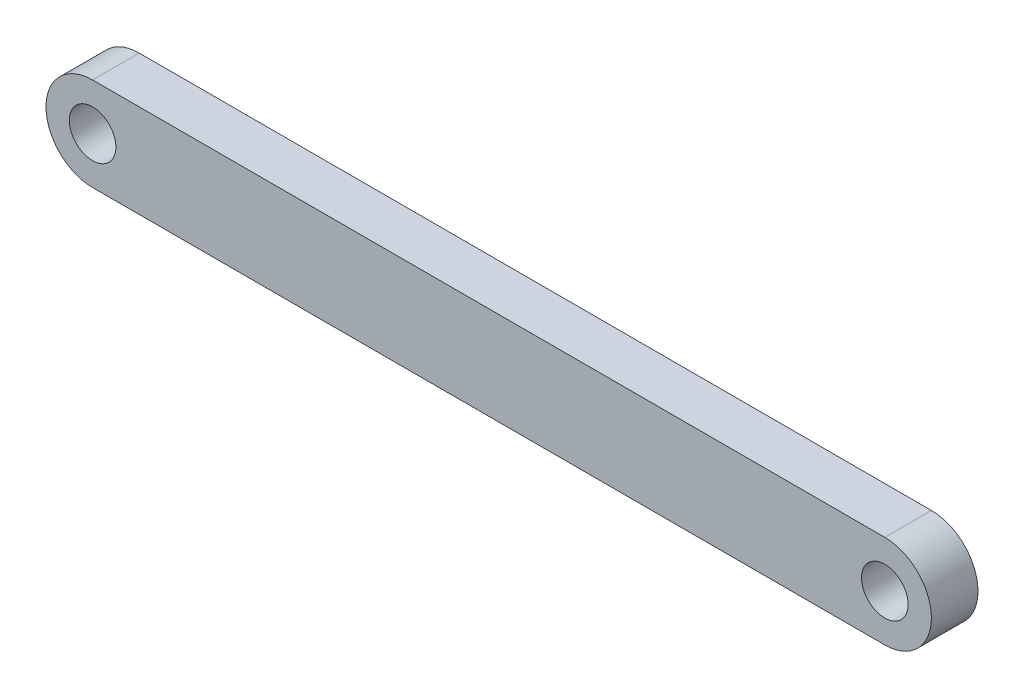
ISO-10303-21;
HEADER;
FILE_DESCRIPTION(('STEP AP214'),'2;1');
FILE_NAME('part.step','',(''),(''),'','','');
FILE_SCHEMA(('AUTOMOTIVE_DESIGN { 1 0 10303 214 1 1 1 1 }'));
ENDSEC;
DATA;
#1=APPLICATION_CONTEXT('core data for automotive mechanical design processes');
#2=APPLICATION_PROTOCOL_DEFINITION('international standard','automotive_design',2000,#1);
#3=PRODUCT_CONTEXT('',#1,'mechanical');
#4=PRODUCT('Part','Part','',(#3));
#5=PRODUCT_RELATED_PRODUCT_CATEGORY('part','',(#4));
#6=PRODUCT_DEFINITION_FORMATION('','',#4);
#7=PRODUCT_DEFINITION_CONTEXT('part definition',#1,'design');
#8=PRODUCT_DEFINITION('design','',#6,#7);
#9=PRODUCT_DEFINITION_SHAPE('','',#8);
#10=(LENGTH_UNIT() NAMED_UNIT(*) SI_UNIT(.MILLI.,.METRE.));
#11=(NAMED_UNIT(*) PLANE_ANGLE_UNIT() SI_UNIT($,.RADIAN.));
#12=(NAMED_UNIT(*) SI_UNIT($,.STERADIAN.) SOLID_ANGLE_UNIT());
#13=UNCERTAINTY_MEASURE_WITH_UNIT(LENGTH_MEASURE(1.E-05),#10,'distance_accuracy_value','');
#14=(GEOMETRIC_REPRESENTATION_CONTEXT(3) GLOBAL_UNCERTAINTY_ASSIGNED_CONTEXT((#13)) GLOBAL_UNIT_ASSIGNED_CONTEXT((#10,
#11,#12)) REPRESENTATION_CONTEXT('',''));
#15=CARTESIAN_POINT('',(0.,0.,0.));
#16=DIRECTION('',(0.,0.,1.));
#17=DIRECTION('',(1.,0.,0.));
#18=AXIS2_PLACEMENT_3D('',#15,#16,#17);
#19=CARTESIAN_POINT('',(-16.9999999773704,0.000877157800007862,2.));
#20=DIRECTION('',(0.,0.,1.));
#21=DIRECTION('',(1.,0.,0.));
#22=AXIS2_PLACEMENT_3D('',#19,#20,#21);
#23=PLANE('',#22);
#24=CARTESIAN_POINT('',(-16.9999999773704,0.000877157800007862,2.));
#25=DIRECTION('',(0.,0.,1.));
#26=DIRECTION('',(1.,0.,0.));
#27=AXIS2_PLACEMENT_3D('',#24,#25,#26);
#28=CIRCLE('',#27,1.);
#29=CARTESIAN_POINT('',(-15.9999999773704,0.000877157800007862,2.));
#30=VERTEX_POINT('',#29);
#31=EDGE_CURVE('E100',#30,#30,#28,.T.);
#32=ORIENTED_EDGE('',*,*,#31,.F.);
#33=EDGE_LOOP('',(#32));
#34=FACE_BOUND('',#33,.T.);
#35=CARTESIAN_POINT('',(-16.9999999773704,0.000877157800007862,2.));
#36=DIRECTION('',(0.,0.,1.));
#37=DIRECTION('',(1.,0.,0.));
#38=AXIS2_PLACEMENT_3D('',#35,#36,#37);
#39=CIRCLE('',#38,2.);
#40=CARTESIAN_POINT('',(-16.9999999773704,2.00087715780001,2.));
#41=VERTEX_POINT('',#40);
#42=CARTESIAN_POINT('',(-16.9999999773704,-1.99912284219999,2.));
#43=VERTEX_POINT('',#42);
#44=EDGE_CURVE('E85',#41,#43,#39,.T.);
#45=ORIENTED_EDGE('',*,*,#44,.T.);
#46=DIRECTION('',(1.,0.,0.));
#47=VECTOR('',#46,1.);
#48=CARTESIAN_POINT('',(-16.9999999773704,-1.99912284219999,2.));
#49=LINE('',#48,#47);
#50=CARTESIAN_POINT('',(17.0000000226296,-1.99912284219999,2.));
#51=VERTEX_POINT('',#50);
#52=EDGE_CURVE('E80',#43,#51,#49,.T.);
#53=ORIENTED_EDGE('',*,*,#52,.T.);
#54=CARTESIAN_POINT('',(17.0000000226296,0.000877157800007862,2.));
#55=DIRECTION('',(0.,0.,1.));
#56=DIRECTION('',(1.,0.,0.));
#57=AXIS2_PLACEMENT_3D('',#54,#55,#56);
#58=CIRCLE('',#57,2.);
#59=CARTESIAN_POINT('',(17.0000000226296,2.00087715780001,2.));
#60=VERTEX_POINT('',#59);
#61=EDGE_CURVE('E83',#51,#60,#58,.T.);
#62=ORIENTED_EDGE('',*,*,#61,.T.);
#63=DIRECTION('',(-1.,0.,0.));
#64=VECTOR('',#63,1.);
#65=CARTESIAN_POINT('',(-16.9999999773704,2.00087715780001,2.));
#66=LINE('',#65,#64);
#67=EDGE_CURVE('E50',#60,#41,#66,.T.);
#68=ORIENTED_EDGE('',*,*,#67,.T.);
#69=EDGE_LOOP('',(#45,#53,#62,#68));
#70=FACE_BOUND('',#69,.T.);
#71=CARTESIAN_POINT('',(17.0000000226296,0.000877157800007862,2.));
#72=DIRECTION('',(0.,0.,1.));
#73=DIRECTION('',(1.,0.,0.));
#74=AXIS2_PLACEMENT_3D('',#71,#72,#73);
#75=CIRCLE('',#74,1.);
#76=CARTESIAN_POINT('',(18.0000000226296,0.000877157800007862,2.));
#77=VERTEX_POINT('',#76);
#78=EDGE_CURVE('E115',#77,#77,#75,.T.);
#79=ORIENTED_EDGE('',*,*,#78,.F.);
#80=EDGE_LOOP('',(#79));
#81=FACE_BOUND('',#80,.T.);
#82=ADVANCED_FACE('F33',(#34,#70,#81),#23,.T.);
#83=CARTESIAN_POINT('',(-16.9999999773704,0.000877157800007862,0.));
#84=DIRECTION('',(0.,0.,1.));
#85=DIRECTION('',(1.,0.,0.));
#86=AXIS2_PLACEMENT_3D('',#83,#84,#85);
#87=PLANE('',#86);
#88=CARTESIAN_POINT('',(-16.9999999773704,0.000877157800007862,0.));
#89=DIRECTION('',(0.,0.,1.));
#90=DIRECTION('',(1.,0.,0.));
#91=AXIS2_PLACEMENT_3D('',#88,#89,#90);
#92=CIRCLE('',#91,2.);
#93=CARTESIAN_POINT('',(-16.9999999773704,2.00087715780001,0.));
#94=VERTEX_POINT('',#93);
#95=CARTESIAN_POINT('',(-16.9999999773704,-1.99912284219999,0.));
#96=VERTEX_POINT('',#95);
#97=EDGE_CURVE('E97',#94,#96,#92,.T.);
#98=ORIENTED_EDGE('',*,*,#97,.F.);
#99=DIRECTION('',(-1.,0.,0.));
#100=VECTOR('',#99,1.);
#101=CARTESIAN_POINT('',(-16.9999999773704,2.00087715780001,0.));
#102=LINE('',#101,#100);
#103=CARTESIAN_POINT('',(17.0000000226296,2.00087715780001,0.));
#104=VERTEX_POINT('',#103);
#105=EDGE_CURVE('E73',#104,#94,#102,.T.);
#106=ORIENTED_EDGE('',*,*,#105,.F.);
#107=CARTESIAN_POINT('',(17.0000000226296,0.000877157800007862,0.));
#108=DIRECTION('',(0.,0.,1.));
#109=DIRECTION('',(1.,0.,0.));
#110=AXIS2_PLACEMENT_3D('',#107,#108,#109);
#111=CIRCLE('',#110,2.);
#112=CARTESIAN_POINT('',(17.0000000226296,-1.99912284219999,0.));
#113=VERTEX_POINT('',#112);
#114=EDGE_CURVE('E67',#113,#104,#111,.T.);
#115=ORIENTED_EDGE('',*,*,#114,.F.);
#116=DIRECTION('',(1.,0.,0.));
#117=VECTOR('',#116,1.);
#118=CARTESIAN_POINT('',(-16.9999999773704,-1.99912284219999,0.));
#119=LINE('',#118,#117);
#120=EDGE_CURVE('E89',#96,#113,#119,.T.);
#121=ORIENTED_EDGE('',*,*,#120,.F.);
#122=EDGE_LOOP('',(#98,#106,#115,#121));
#123=FACE_BOUND('',#122,.T.);
#124=CARTESIAN_POINT('',(-16.9999999773704,0.000877157800007862,0.));
#125=DIRECTION('',(0.,0.,1.));
#126=DIRECTION('',(1.,0.,0.));
#127=AXIS2_PLACEMENT_3D('',#124,#125,#126);
#128=CIRCLE('',#127,1.);
#129=CARTESIAN_POINT('',(-15.9999999773704,0.000877157800007862,0.));
#130=VERTEX_POINT('',#129);
#131=EDGE_CURVE('E112',#130,#130,#128,.T.);
#132=ORIENTED_EDGE('',*,*,#131,.T.);
#133=EDGE_LOOP('',(#132));
#134=FACE_BOUND('',#133,.T.);
#135=CARTESIAN_POINT('',(17.0000000226296,0.000877157800007862,0.));
#136=DIRECTION('',(0.,0.,1.));
#137=DIRECTION('',(1.,0.,0.));
#138=AXIS2_PLACEMENT_3D('',#135,#136,#137);
#139=CIRCLE('',#138,1.);
#140=CARTESIAN_POINT('',(18.0000000226296,0.000877157800007862,0.));
#141=VERTEX_POINT('',#140);
#142=EDGE_CURVE('E118',#141,#141,#139,.T.);
#143=ORIENTED_EDGE('',*,*,#142,.T.);
#144=EDGE_LOOP('',(#143));
#145=FACE_BOUND('',#144,.T.);
#146=ADVANCED_FACE('F108',(#123,#134,#145),#87,.F.);
#147=CARTESIAN_POINT('',(-16.9999999773704,0.000877157800007862,2.));
#148=DIRECTION('',(0.,0.,-1.));
#149=DIRECTION('',(-1.,0.,0.));
#150=AXIS2_PLACEMENT_3D('',#147,#148,#149);
#151=CYLINDRICAL_SURFACE('',#150,2.);
#152=ORIENTED_EDGE('',*,*,#97,.T.);
#153=DIRECTION('',(0.,0.,-1.));
#154=VECTOR('',#153,1.);
#155=CARTESIAN_POINT('',(-16.9999999773704,-1.99912284219999,2.));
#156=LINE('',#155,#154);
#157=EDGE_CURVE('E11',#43,#96,#156,.T.);
#158=ORIENTED_EDGE('',*,*,#157,.F.);
#159=ORIENTED_EDGE('',*,*,#44,.F.);
#160=DIRECTION('',(0.,0.,-1.));
#161=VECTOR('',#160,1.);
#162=CARTESIAN_POINT('',(-16.9999999773704,2.00087715780001,2.));
#163=LINE('',#162,#161);
#164=EDGE_CURVE('E93',#41,#94,#163,.T.);
#165=ORIENTED_EDGE('',*,*,#164,.T.);
#166=EDGE_LOOP('',(#152,#158,#159,#165));
#167=FACE_BOUND('',#166,.T.);
#168=ADVANCED_FACE('F35',(#167),#151,.T.);
#169=CARTESIAN_POINT('',(-16.9999999773704,-1.99912284219999,2.));
#170=DIRECTION('',(0.,1.,0.));
#171=DIRECTION('',(0.,0.,1.));
#172=AXIS2_PLACEMENT_3D('',#169,#170,#171);
#173=PLANE('',#172);
#174=ORIENTED_EDGE('',*,*,#120,.T.);
#175=DIRECTION('',(0.,0.,-1.));
#176=VECTOR('',#175,1.);
#177=CARTESIAN_POINT('',(17.0000000226296,-1.99912284219999,2.));
#178=LINE('',#177,#176);
#179=EDGE_CURVE('E42',#51,#113,#178,.T.);
#180=ORIENTED_EDGE('',*,*,#179,.F.);
#181=ORIENTED_EDGE('',*,*,#52,.F.);
#182=ORIENTED_EDGE('',*,*,#157,.T.);
#183=EDGE_LOOP('',(#174,#180,#181,#182));
#184=FACE_BOUND('',#183,.T.);
#185=ADVANCED_FACE('F88',(#184),#173,.F.);
#186=CARTESIAN_POINT('',(17.0000000226296,0.000877157800007862,2.));
#187=DIRECTION('',(0.,0.,-1.));
#188=DIRECTION('',(-1.,0.,0.));
#189=AXIS2_PLACEMENT_3D('',#186,#187,#188);
#190=CYLINDRICAL_SURFACE('',#189,2.);
#191=ORIENTED_EDGE('',*,*,#114,.T.);
#192=DIRECTION('',(0.,0.,-1.));
#193=VECTOR('',#192,1.);
#194=CARTESIAN_POINT('',(17.0000000226296,2.00087715780001,2.));
#195=LINE('',#194,#193);
#196=EDGE_CURVE('E90',#60,#104,#195,.T.);
#197=ORIENTED_EDGE('',*,*,#196,.F.);
#198=ORIENTED_EDGE('',*,*,#61,.F.);
#199=ORIENTED_EDGE('',*,*,#179,.T.);
#200=EDGE_LOOP('',(#191,#197,#198,#199));
#201=FACE_BOUND('',#200,.T.);
#202=ADVANCED_FACE('F91',(#201),#190,.T.);
#203=CARTESIAN_POINT('',(-16.9999999773704,2.00087715780001,2.));
#204=DIRECTION('',(0.,-1.,0.));
#205=DIRECTION('',(0.,0.,-1.));
#206=AXIS2_PLACEMENT_3D('',#203,#204,#205);
#207=PLANE('',#206);
#208=ORIENTED_EDGE('',*,*,#105,.T.);
#209=ORIENTED_EDGE('',*,*,#164,.F.);
#210=ORIENTED_EDGE('',*,*,#67,.F.);
#211=ORIENTED_EDGE('',*,*,#196,.T.);
#212=EDGE_LOOP('',(#208,#209,#210,#211));
#213=FACE_BOUND('',#212,.T.);
#214=ADVANCED_FACE('F105',(#213),#207,.F.);
#215=CARTESIAN_POINT('',(-16.9999999773704,0.000877157800007862,2.));
#216=DIRECTION('',(0.,0.,-1.));
#217=DIRECTION('',(-1.,0.,0.));
#218=AXIS2_PLACEMENT_3D('',#215,#216,#217);
#219=CYLINDRICAL_SURFACE('',#218,1.);
#220=ORIENTED_EDGE('',*,*,#31,.T.);
#221=EDGE_LOOP('',(#220));
#222=FACE_BOUND('',#221,.T.);
#223=ORIENTED_EDGE('',*,*,#131,.F.);
#224=EDGE_LOOP('',(#223));
#225=FACE_BOUND('',#224,.T.);
#226=ADVANCED_FACE('F135',(#222,#225),#219,.F.);
#227=CARTESIAN_POINT('',(17.0000000226296,0.000877157800007862,2.));
#228=DIRECTION('',(0.,0.,-1.));
#229=DIRECTION('',(-1.,0.,0.));
#230=AXIS2_PLACEMENT_3D('',#227,#228,#229);
#231=CYLINDRICAL_SURFACE('',#230,1.);
#232=ORIENTED_EDGE('',*,*,#78,.T.);
#233=EDGE_LOOP('',(#232));
#234=FACE_BOUND('',#233,.T.);
#235=ORIENTED_EDGE('',*,*,#142,.F.);
#236=EDGE_LOOP('',(#235));
#237=FACE_BOUND('',#236,.T.);
#238=ADVANCED_FACE('F124',(#234,#237),#231,.F.);
#239=CLOSED_SHELL('',(#82,#146,#168,#185,#202,#214,#226,#238));
#240=MANIFOLD_SOLID_BREP('B2',#239);
#241=ADVANCED_BREP_SHAPE_REPRESENTATION('',(#18,#240),#14);
#242=SHAPE_DEFINITION_REPRESENTATION(#9,#241);
ENDSEC;
END-ISO-10303-21;
